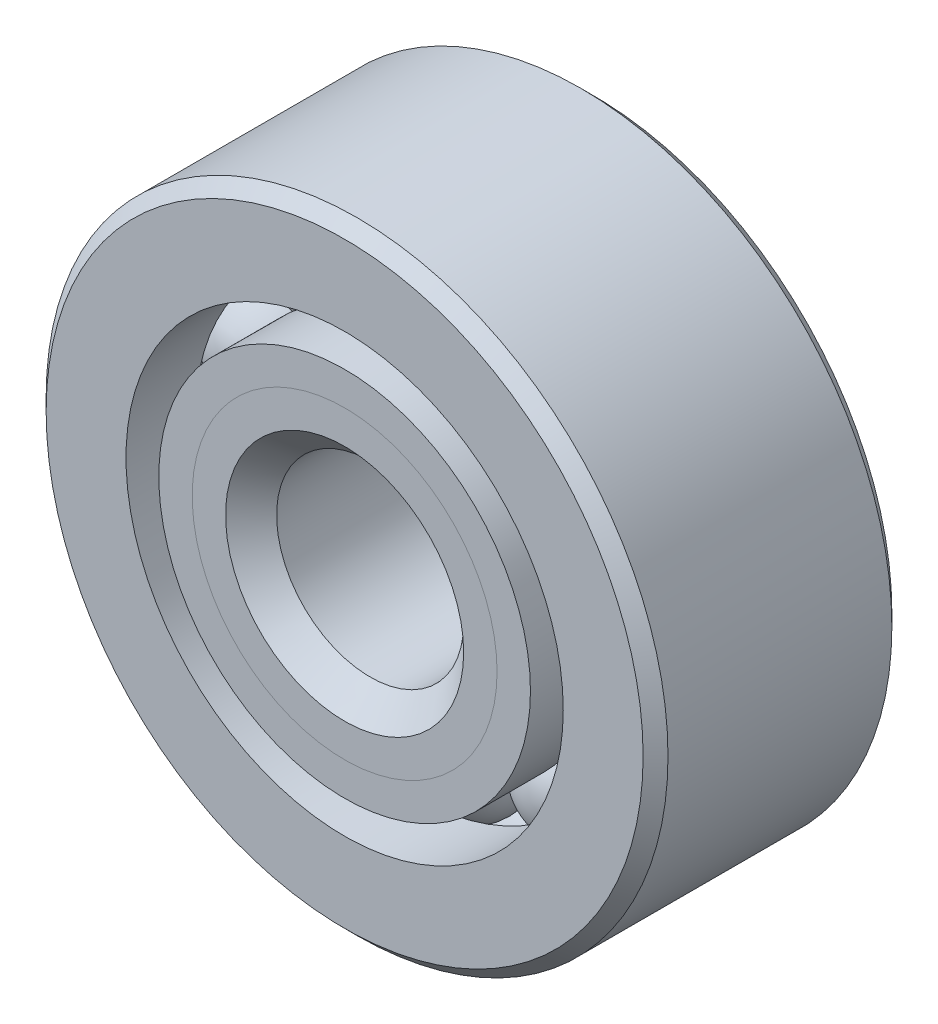
ISO-10303-21;
HEADER;
FILE_DESCRIPTION(('STEP AP214'),'2;1');
FILE_NAME('part.step','',(''),(''),'','','');
FILE_SCHEMA(('AUTOMOTIVE_DESIGN { 1 0 10303 214 1 1 1 1 }'));
ENDSEC;
DATA;
#1=APPLICATION_CONTEXT('core data for automotive mechanical design processes');
#2=APPLICATION_PROTOCOL_DEFINITION('international standard','automotive_design',2000,#1);
#3=PRODUCT_CONTEXT('',#1,'mechanical');
#4=PRODUCT('Part','Part','',(#3));
#5=PRODUCT_RELATED_PRODUCT_CATEGORY('part','',(#4));
#6=PRODUCT_DEFINITION_FORMATION('','',#4);
#7=PRODUCT_DEFINITION_CONTEXT('part definition',#1,'design');
#8=PRODUCT_DEFINITION('design','',#6,#7);
#9=PRODUCT_DEFINITION_SHAPE('','',#8);
#10=(LENGTH_UNIT() NAMED_UNIT(*) SI_UNIT(.MILLI.,.METRE.));
#11=(NAMED_UNIT(*) PLANE_ANGLE_UNIT() SI_UNIT($,.RADIAN.));
#12=(NAMED_UNIT(*) SI_UNIT($,.STERADIAN.) SOLID_ANGLE_UNIT());
#13=UNCERTAINTY_MEASURE_WITH_UNIT(LENGTH_MEASURE(1.E-05),#10,'distance_accuracy_value','');
#14=(GEOMETRIC_REPRESENTATION_CONTEXT(3) GLOBAL_UNCERTAINTY_ASSIGNED_CONTEXT((#13)) GLOBAL_UNIT_ASSIGNED_CONTEXT((#10,
#11,#12)) REPRESENTATION_CONTEXT('',''));
#15=CARTESIAN_POINT('',(0.,0.,0.));
#16=DIRECTION('',(0.,0.,1.));
#17=DIRECTION('',(1.,0.,0.));
#18=AXIS2_PLACEMENT_3D('',#15,#16,#17);
#19=CARTESIAN_POINT('',(-0.758617688555613,1.04414767107761,0.));
#20=DIRECTION('',(0.,0.,1.));
#21=DIRECTION('',(-0.587785252292462,0.809016994374955,0.));
#22=AXIS2_PLACEMENT_3D('',#19,#20,#21);
#23=SPHERICAL_SURFACE('',#22,0.367978312414091);
#24=CARTESIAN_POINT('',(-0.758617688555613,1.04414767107761,0.367978312414091));
#25=VERTEX_POINT('',#24);
#26=VERTEX_LOOP('',#25);
#27=FACE_BOUND('',#26,.T.);
#28=ADVANCED_FACE('F46',(#27),#23,.T.);
#29=CLOSED_SHELL('',(#28));
#30=MANIFOLD_SOLID_BREP('B2',#29);
#31=CARTESIAN_POINT('',(-1.22746920454988,0.39882892107761,0.));
#32=DIRECTION('',(0.,0.,1.));
#33=DIRECTION('',(-0.95105651629515,0.309016994374958,0.));
#34=AXIS2_PLACEMENT_3D('',#31,#32,#33);
#35=SPHERICAL_SURFACE('',#34,0.367978312414091);
#36=CARTESIAN_POINT('',(-1.22746920454988,0.39882892107761,0.367978312414091));
#37=VERTEX_POINT('',#36);
#38=VERTEX_LOOP('',#37);
#39=FACE_BOUND('',#38,.T.);
#40=ADVANCED_FACE('F81',(#39),#35,.T.);
#41=CLOSED_SHELL('',(#40));
#42=MANIFOLD_SOLID_BREP('B6',#41);
#43=CARTESIAN_POINT('',(-1.22746920454989,-0.398828921077584,0.));
#44=DIRECTION('',(0.,0.,1.));
#45=DIRECTION('',(-0.951056516295157,-0.309016994374938,0.));
#46=AXIS2_PLACEMENT_3D('',#43,#44,#45);
#47=SPHERICAL_SURFACE('',#46,0.367978312414091);
#48=CARTESIAN_POINT('',(-1.22746920454989,-0.398828921077584,0.367978312414091));
#49=VERTEX_POINT('',#48);
#50=VERTEX_LOOP('',#49);
#51=FACE_BOUND('',#50,.T.);
#52=ADVANCED_FACE('F118',(#51),#47,.T.);
#53=CLOSED_SHELL('',(#52));
#54=MANIFOLD_SOLID_BREP('B42',#53);
#55=CARTESIAN_POINT('',(-0.758617688555636,-1.04414767107759,0.));
#56=DIRECTION('',(0.,0.,1.));
#57=DIRECTION('',(-0.58778525229248,-0.809016994374942,0.));
#58=AXIS2_PLACEMENT_3D('',#55,#56,#57);
#59=SPHERICAL_SURFACE('',#58,0.367978312414091);
#60=CARTESIAN_POINT('',(-0.758617688555636,-1.04414767107759,0.367978312414091));
#61=VERTEX_POINT('',#60);
#62=VERTEX_LOOP('',#61);
#63=FACE_BOUND('',#62,.T.);
#64=ADVANCED_FACE('F155',(#63),#59,.T.);
#65=CLOSED_SHELL('',(#64));
#66=MANIFOLD_SOLID_BREP('B77',#65);
#67=CARTESIAN_POINT('',(0.,-1.2906375,0.));
#68=DIRECTION('',(0.,0.,1.));
#69=DIRECTION('',(0.,-1.,0.));
#70=AXIS2_PLACEMENT_3D('',#67,#68,#69);
#71=SPHERICAL_SURFACE('',#70,0.367978312414091);
#72=CARTESIAN_POINT('',(0.,-1.2906375,0.367978312414091));
#73=VERTEX_POINT('',#72);
#74=VERTEX_LOOP('',#73);
#75=FACE_BOUND('',#74,.T.);
#76=ADVANCED_FACE('F192',(#75),#71,.T.);
#77=CLOSED_SHELL('',(#76));
#78=MANIFOLD_SOLID_BREP('B114',#77);
#79=CARTESIAN_POINT('',(0.758617688555621,-1.0441476710776,0.));
#80=DIRECTION('',(0.,0.,1.));
#81=DIRECTION('',(0.587785252292469,-0.809016994374951,0.));
#82=AXIS2_PLACEMENT_3D('',#79,#80,#81);
#83=SPHERICAL_SURFACE('',#82,0.367978312414091);
#84=CARTESIAN_POINT('',(0.758617688555621,-1.0441476710776,0.367978312414091));
#85=VERTEX_POINT('',#84);
#86=VERTEX_LOOP('',#85);
#87=FACE_BOUND('',#86,.T.);
#88=ADVANCED_FACE('F227',(#87),#83,.T.);
#89=CLOSED_SHELL('',(#88));
#90=MANIFOLD_SOLID_BREP('B151',#89);
#91=CARTESIAN_POINT('',(1.22746920454988,-0.398828921077602,0.));
#92=DIRECTION('',(0.,0.,1.));
#93=DIRECTION('',(0.951056516295152,-0.309016994374952,0.));
#94=AXIS2_PLACEMENT_3D('',#91,#92,#93);
#95=SPHERICAL_SURFACE('',#94,0.367978312414091);
#96=CARTESIAN_POINT('',(1.22746920454988,-0.398828921077602,0.367978312414091));
#97=VERTEX_POINT('',#96);
#98=VERTEX_LOOP('',#97);
#99=FACE_BOUND('',#98,.T.);
#100=ADVANCED_FACE('F262',(#99),#95,.T.);
#101=CLOSED_SHELL('',(#100));
#102=MANIFOLD_SOLID_BREP('B188',#101);
#103=CARTESIAN_POINT('',(1.22746920454989,0.398828921077593,0.));
#104=DIRECTION('',(0.,0.,1.));
#105=DIRECTION('',(0.951056516295155,0.309016994374945,0.));
#106=AXIS2_PLACEMENT_3D('',#103,#104,#105);
#107=SPHERICAL_SURFACE('',#106,0.367978312414091);
#108=CARTESIAN_POINT('',(1.22746920454989,0.398828921077593,0.367978312414091));
#109=VERTEX_POINT('',#108);
#110=VERTEX_LOOP('',#109);
#111=FACE_BOUND('',#110,.T.);
#112=ADVANCED_FACE('F297',(#111),#107,.T.);
#113=CLOSED_SHELL('',(#112));
#114=MANIFOLD_SOLID_BREP('B223',#113);
#115=CARTESIAN_POINT('',(0.758617688555628,1.0441476710776,0.));
#116=DIRECTION('',(0.,0.,1.));
#117=DIRECTION('',(0.587785252292474,0.809016994374947,0.));
#118=AXIS2_PLACEMENT_3D('',#115,#116,#117);
#119=SPHERICAL_SURFACE('',#118,0.367978312414091);
#120=CARTESIAN_POINT('',(0.758617688555628,1.0441476710776,0.367978312414091));
#121=VERTEX_POINT('',#120);
#122=VERTEX_LOOP('',#121);
#123=FACE_BOUND('',#122,.T.);
#124=ADVANCED_FACE('F332',(#123),#119,.T.);
#125=CLOSED_SHELL('',(#124));
#126=MANIFOLD_SOLID_BREP('B258',#125);
#127=CARTESIAN_POINT('',(0.,1.2906375,0.));
#128=DIRECTION('',(0.,0.,1.));
#129=DIRECTION('',(0.,1.,0.));
#130=AXIS2_PLACEMENT_3D('',#127,#128,#129);
#131=SPHERICAL_SURFACE('',#130,0.367978312414091);
#132=CARTESIAN_POINT('',(0.,1.2906375,0.367978312414091));
#133=VERTEX_POINT('',#132);
#134=VERTEX_LOOP('',#133);
#135=FACE_BOUND('',#134,.T.);
#136=ADVANCED_FACE('F369',(#135),#131,.T.);
#137=CLOSED_SHELL('',(#136));
#138=MANIFOLD_SOLID_BREP('B293',#137);
#139=CARTESIAN_POINT('',(0.,0.972873382061313,0.79375));
#140=DIRECTION('',(0.,0.,-1.));
#141=DIRECTION('',(-1.,0.,0.));
#142=AXIS2_PLACEMENT_3D('',#139,#140,#141);
#143=PLANE('',#142);
#144=CARTESIAN_POINT('',(0.,0.,0.79375));
#145=DIRECTION('',(0.,0.,1.));
#146=DIRECTION('',(1.,0.,0.));
#147=AXIS2_PLACEMENT_3D('',#144,#145,#146);
#148=CIRCLE('',#147,0.759779593792954);
#149=CARTESIAN_POINT('',(0.759779593792954,0.,0.79375));
#150=VERTEX_POINT('',#149);
#151=EDGE_CURVE('E435',#150,#150,#148,.T.);
#152=ORIENTED_EDGE('',*,*,#151,.F.);
#153=EDGE_LOOP('',(#152));
#154=FACE_BOUND('',#153,.T.);
#155=CARTESIAN_POINT('',(0.,0.,0.79375));
#156=DIRECTION('',(0.,0.,1.));
#157=DIRECTION('',(1.,0.,0.));
#158=AXIS2_PLACEMENT_3D('',#155,#156,#157);
#159=CIRCLE('',#158,0.972873382061313);
#160=CARTESIAN_POINT('',(0.972873382061313,0.,0.79375));
#161=VERTEX_POINT('',#160);
#162=EDGE_CURVE('E368',#161,#161,#159,.T.);
#163=ORIENTED_EDGE('',*,*,#162,.T.);
#164=EDGE_LOOP('',(#163));
#165=FACE_BOUND('',#164,.T.);
#166=ADVANCED_FACE('F390',(#154,#165),#143,.F.);
#167=CARTESIAN_POINT('',(0.,0.,0.580656211731643));
#168=DIRECTION('',(0.,0.,1.));
#169=DIRECTION('',(1.,0.,0.));
#170=AXIS2_PLACEMENT_3D('',#167,#168,#169);
#171=CONICAL_SURFACE('',#170,0.759779593792954,0.78539816339745);
#172=ORIENTED_EDGE('',*,*,#162,.F.);
#173=EDGE_LOOP('',(#172));
#174=FACE_BOUND('',#173,.T.);
#175=CARTESIAN_POINT('',(0.,0.,0.580656211731643));
#176=DIRECTION('',(0.,0.,1.));
#177=DIRECTION('',(1.,0.,0.));
#178=AXIS2_PLACEMENT_3D('',#175,#176,#177);
#179=CIRCLE('',#178,0.759779593792954);
#180=CARTESIAN_POINT('',(0.759779593792954,0.,0.580656211731643));
#181=VERTEX_POINT('',#180);
#182=EDGE_CURVE('E397',#181,#181,#179,.T.);
#183=ORIENTED_EDGE('',*,*,#182,.T.);
#184=EDGE_LOOP('',(#183));
#185=FACE_BOUND('',#184,.T.);
#186=ADVANCED_FACE('F444',(#174,#185),#171,.T.);
#187=CARTESIAN_POINT('',(0.,0.,0.79375));
#188=DIRECTION('',(0.,0.,1.));
#189=DIRECTION('',(1.,0.,0.));
#190=AXIS2_PLACEMENT_3D('',#187,#188,#189);
#191=CYLINDRICAL_SURFACE('',#190,0.759779593792954);
#192=ORIENTED_EDGE('',*,*,#182,.F.);
#193=EDGE_LOOP('',(#192));
#194=FACE_BOUND('',#193,.T.);
#195=CARTESIAN_POINT('',(0.,0.,0.));
#196=DIRECTION('',(0.,0.,1.));
#197=DIRECTION('',(1.,0.,0.));
#198=AXIS2_PLACEMENT_3D('',#195,#196,#197);
#199=CIRCLE('',#198,0.759779593792954);
#200=CARTESIAN_POINT('',(0.759779593792954,0.,0.));
#201=VERTEX_POINT('',#200);
#202=EDGE_CURVE('E403',#201,#201,#199,.T.);
#203=ORIENTED_EDGE('',*,*,#202,.T.);
#204=EDGE_LOOP('',(#203));
#205=FACE_BOUND('',#204,.T.);
#206=ADVANCED_FACE('F448',(#194,#205),#191,.T.);
#207=CARTESIAN_POINT('',(0.,0.759779593792954,0.));
#208=DIRECTION('',(0.,0.,-1.));
#209=DIRECTION('',(-1.,0.,0.));
#210=AXIS2_PLACEMENT_3D('',#207,#208,#209);
#211=PLANE('',#210);
#212=ORIENTED_EDGE('',*,*,#202,.F.);
#213=EDGE_LOOP('',(#212));
#214=FACE_BOUND('',#213,.T.);
#215=CARTESIAN_POINT('',(0.,0.,0.));
#216=DIRECTION('',(0.,0.,1.));
#217=DIRECTION('',(1.,0.,0.));
#218=AXIS2_PLACEMENT_3D('',#215,#216,#217);
#219=CIRCLE('',#218,0.922659187585909);
#220=CARTESIAN_POINT('',(0.922659187585909,0.,0.));
#221=VERTEX_POINT('',#220);
#222=EDGE_CURVE('E409',#221,#221,#219,.T.);
#223=ORIENTED_EDGE('',*,*,#222,.T.);
#224=EDGE_LOOP('',(#223));
#225=FACE_BOUND('',#224,.T.);
#226=ADVANCED_FACE('F453',(#214,#225),#211,.F.);
#227=CARTESIAN_POINT('',(0.,0.,0.));
#228=DIRECTION('',(0.,0.,1.));
#229=DIRECTION('',(1.,0.,0.));
#230=AXIS2_PLACEMENT_3D('',#227,#228,#229);
#231=TOROIDAL_SURFACE('',#230,1.2906375,0.367978312414091);
#232=ORIENTED_EDGE('',*,*,#222,.F.);
#233=EDGE_LOOP('',(#232));
#234=FACE_BOUND('',#233,.T.);
#235=CARTESIAN_POINT('',(0.,0.,-0.352777777777778));
#236=DIRECTION('',(0.,0.,1.));
#237=DIRECTION('',(1.,0.,0.));
#238=AXIS2_PLACEMENT_3D('',#235,#236,#237);
#239=CIRCLE('',#238,1.18596717032967);
#240=CARTESIAN_POINT('',(1.18596717032967,0.,-0.352777777777778));
#241=VERTEX_POINT('',#240);
#242=EDGE_CURVE('E415',#241,#241,#239,.T.);
#243=ORIENTED_EDGE('',*,*,#242,.T.);
#244=EDGE_LOOP('',(#243));
#245=FACE_BOUND('',#244,.T.);
#246=ADVANCED_FACE('F459',(#234,#245),#231,.F.);
#247=CARTESIAN_POINT('',(0.,0.,0.79375));
#248=DIRECTION('',(0.,0.,1.));
#249=DIRECTION('',(1.,0.,0.));
#250=AXIS2_PLACEMENT_3D('',#247,#248,#249);
#251=CYLINDRICAL_SURFACE('',#250,1.18596717032967);
#252=ORIENTED_EDGE('',*,*,#242,.F.);
#253=EDGE_LOOP('',(#252));
#254=FACE_BOUND('',#253,.T.);
#255=CARTESIAN_POINT('',(0.,0.,-0.793750000000001));
#256=DIRECTION('',(0.,0.,1.));
#257=DIRECTION('',(1.,0.,0.));
#258=AXIS2_PLACEMENT_3D('',#255,#256,#257);
#259=CIRCLE('',#258,1.18596717032967);
#260=CARTESIAN_POINT('',(1.18596717032967,0.,-0.793750000000001));
#261=VERTEX_POINT('',#260);
#262=EDGE_CURVE('E419',#261,#261,#259,.T.);
#263=ORIENTED_EDGE('',*,*,#262,.T.);
#264=EDGE_LOOP('',(#263));
#265=FACE_BOUND('',#264,.T.);
#266=ADVANCED_FACE('F463',(#254,#265),#251,.T.);
#267=CARTESIAN_POINT('',(0.,0.676274999999999,-0.793750000000001));
#268=DIRECTION('',(0.,0.,1.));
#269=DIRECTION('',(1.,0.,0.));
#270=AXIS2_PLACEMENT_3D('',#267,#268,#269);
#271=PLANE('',#270);
#272=ORIENTED_EDGE('',*,*,#262,.F.);
#273=EDGE_LOOP('',(#272));
#274=FACE_BOUND('',#273,.T.);
#275=CARTESIAN_POINT('',(0.,0.,-0.793750000000001));
#276=DIRECTION('',(0.,0.,1.));
#277=DIRECTION('',(1.,0.,0.));
#278=AXIS2_PLACEMENT_3D('',#275,#276,#277);
#279=CIRCLE('',#278,0.676274999999999);
#280=CARTESIAN_POINT('',(0.676274999999999,0.,-0.793750000000001));
#281=VERTEX_POINT('',#280);
#282=EDGE_CURVE('E423',#281,#281,#279,.T.);
#283=ORIENTED_EDGE('',*,*,#282,.T.);
#284=EDGE_LOOP('',(#283));
#285=FACE_BOUND('',#284,.T.);
#286=ADVANCED_FACE('F467',(#274,#285),#271,.F.);
#287=CARTESIAN_POINT('',(0.,0.,-0.714375000000001));
#288=DIRECTION('',(0.,0.,-1.));
#289=DIRECTION('',(-1.,0.,0.));
#290=AXIS2_PLACEMENT_3D('',#287,#288,#289);
#291=CONICAL_SURFACE('',#290,0.5969,0.785398163397446);
#292=ORIENTED_EDGE('',*,*,#282,.F.);
#293=EDGE_LOOP('',(#292));
#294=FACE_BOUND('',#293,.T.);
#295=CARTESIAN_POINT('',(0.,0.,-0.714375000000001));
#296=DIRECTION('',(0.,0.,1.));
#297=DIRECTION('',(1.,0.,0.));
#298=AXIS2_PLACEMENT_3D('',#295,#296,#297);
#299=CIRCLE('',#298,0.5969);
#300=CARTESIAN_POINT('',(0.5969,0.,-0.714375000000001));
#301=VERTEX_POINT('',#300);
#302=EDGE_CURVE('E427',#301,#301,#299,.T.);
#303=ORIENTED_EDGE('',*,*,#302,.T.);
#304=EDGE_LOOP('',(#303));
#305=FACE_BOUND('',#304,.T.);
#306=ADVANCED_FACE('F471',(#294,#305),#291,.F.);
#307=CARTESIAN_POINT('',(0.,0.,0.79375));
#308=DIRECTION('',(0.,0.,1.));
#309=DIRECTION('',(1.,0.,0.));
#310=AXIS2_PLACEMENT_3D('',#307,#308,#309);
#311=CYLINDRICAL_SURFACE('',#310,0.5969);
#312=ORIENTED_EDGE('',*,*,#302,.F.);
#313=EDGE_LOOP('',(#312));
#314=FACE_BOUND('',#313,.T.);
#315=CARTESIAN_POINT('',(0.,0.,0.630870406207046));
#316=DIRECTION('',(0.,0.,1.));
#317=DIRECTION('',(1.,0.,0.));
#318=AXIS2_PLACEMENT_3D('',#315,#316,#317);
#319=CIRCLE('',#318,0.5969);
#320=CARTESIAN_POINT('',(0.5969,0.,0.630870406207046));
#321=VERTEX_POINT('',#320);
#322=EDGE_CURVE('E431',#321,#321,#319,.T.);
#323=ORIENTED_EDGE('',*,*,#322,.T.);
#324=EDGE_LOOP('',(#323));
#325=FACE_BOUND('',#324,.T.);
#326=ADVANCED_FACE('F475',(#314,#325),#311,.F.);
#327=CARTESIAN_POINT('',(0.,0.,0.79375));
#328=DIRECTION('',(0.,0.,1.));
#329=DIRECTION('',(1.,0.,0.));
#330=AXIS2_PLACEMENT_3D('',#327,#328,#329);
#331=CONICAL_SURFACE('',#330,0.759779593792954,0.785398163397448);
#332=ORIENTED_EDGE('',*,*,#322,.F.);
#333=EDGE_LOOP('',(#332));
#334=FACE_BOUND('',#333,.T.);
#335=ORIENTED_EDGE('',*,*,#151,.T.);
#336=EDGE_LOOP('',(#335));
#337=FACE_BOUND('',#336,.T.);
#338=ADVANCED_FACE('F441',(#334,#337),#331,.F.);
#339=CLOSED_SHELL('',(#166,#186,#206,#226,#246,#266,#286,#306,#326,#338));
#340=MANIFOLD_SOLID_BREP('B328',#339);
#341=CARTESIAN_POINT('',(0.,1.18596717032967,0.79375));
#342=DIRECTION('',(0.,0.,-1.));
#343=DIRECTION('',(-1.,0.,0.));
#344=AXIS2_PLACEMENT_3D('',#341,#342,#343);
#345=PLANE('',#344);
#346=CARTESIAN_POINT('',(0.,0.,0.79375));
#347=DIRECTION('',(0.,0.,1.));
#348=DIRECTION('',(1.,0.,0.));
#349=AXIS2_PLACEMENT_3D('',#346,#347,#348);
#350=CIRCLE('',#349,0.972873382061313);
#351=CARTESIAN_POINT('',(0.972873382061313,0.,0.79375));
#352=VERTEX_POINT('',#351);
#353=EDGE_CURVE('E389',#352,#352,#350,.T.);
#354=ORIENTED_EDGE('',*,*,#353,.F.);
#355=EDGE_LOOP('',(#354));
#356=FACE_BOUND('',#355,.T.);
#357=CARTESIAN_POINT('',(0.,0.,0.79375));
#358=DIRECTION('',(0.,0.,1.));
#359=DIRECTION('',(1.,0.,0.));
#360=AXIS2_PLACEMENT_3D('',#357,#358,#359);
#361=CIRCLE('',#360,1.18596717032967);
#362=CARTESIAN_POINT('',(1.18596717032967,0.,0.79375));
#363=VERTEX_POINT('',#362);
#364=EDGE_CURVE('E598',#363,#363,#361,.T.);
#365=ORIENTED_EDGE('',*,*,#364,.T.);
#366=EDGE_LOOP('',(#365));
#367=FACE_BOUND('',#366,.T.);
#368=ADVANCED_FACE('F569',(#356,#367),#345,.F.);
#369=CARTESIAN_POINT('',(0.,0.,0.79375));
#370=DIRECTION('',(0.,0.,1.));
#371=DIRECTION('',(1.,0.,0.));
#372=AXIS2_PLACEMENT_3D('',#369,#370,#371);
#373=CONICAL_SURFACE('',#372,0.972873382061313,0.78539816339745);
#374=CARTESIAN_POINT('',(0.,0.,0.580656211731643));
#375=DIRECTION('',(0.,0.,1.));
#376=DIRECTION('',(1.,0.,0.));
#377=AXIS2_PLACEMENT_3D('',#374,#375,#376);
#378=CIRCLE('',#377,0.759779593792954);
#379=CARTESIAN_POINT('',(0.759779593792954,0.,0.580656211731643));
#380=VERTEX_POINT('',#379);
#381=EDGE_CURVE('E576',#380,#380,#378,.T.);
#382=ORIENTED_EDGE('',*,*,#381,.F.);
#383=EDGE_LOOP('',(#382));
#384=FACE_BOUND('',#383,.T.);
#385=ORIENTED_EDGE('',*,*,#353,.T.);
#386=EDGE_LOOP('',(#385));
#387=FACE_BOUND('',#386,.T.);
#388=ADVANCED_FACE('F625',(#384,#387),#373,.F.);
#389=CARTESIAN_POINT('',(0.,0.,0.79375));
#390=DIRECTION('',(0.,0.,1.));
#391=DIRECTION('',(1.,0.,0.));
#392=AXIS2_PLACEMENT_3D('',#389,#390,#391);
#393=CYLINDRICAL_SURFACE('',#392,0.759779593792954);
#394=CARTESIAN_POINT('',(0.,0.,0.));
#395=DIRECTION('',(0.,0.,1.));
#396=DIRECTION('',(1.,0.,0.));
#397=AXIS2_PLACEMENT_3D('',#394,#395,#396);
#398=CIRCLE('',#397,0.759779593792954);
#399=CARTESIAN_POINT('',(0.759779593792954,0.,0.));
#400=VERTEX_POINT('',#399);
#401=EDGE_CURVE('E582',#400,#400,#398,.T.);
#402=ORIENTED_EDGE('',*,*,#401,.F.);
#403=EDGE_LOOP('',(#402));
#404=FACE_BOUND('',#403,.T.);
#405=ORIENTED_EDGE('',*,*,#381,.T.);
#406=EDGE_LOOP('',(#405));
#407=FACE_BOUND('',#406,.T.);
#408=ADVANCED_FACE('F620',(#404,#407),#393,.F.);
#409=CARTESIAN_POINT('',(0.,0.759779593792954,0.));
#410=DIRECTION('',(0.,0.,1.));
#411=DIRECTION('',(1.,0.,0.));
#412=AXIS2_PLACEMENT_3D('',#409,#410,#411);
#413=PLANE('',#412);
#414=CARTESIAN_POINT('',(0.,0.,0.));
#415=DIRECTION('',(0.,0.,1.));
#416=DIRECTION('',(1.,0.,0.));
#417=AXIS2_PLACEMENT_3D('',#414,#415,#416);
#418=CIRCLE('',#417,0.922659187585909);
#419=CARTESIAN_POINT('',(0.922659187585909,0.,0.));
#420=VERTEX_POINT('',#419);
#421=EDGE_CURVE('E588',#420,#420,#418,.T.);
#422=ORIENTED_EDGE('',*,*,#421,.F.);
#423=EDGE_LOOP('',(#422));
#424=FACE_BOUND('',#423,.T.);
#425=ORIENTED_EDGE('',*,*,#401,.T.);
#426=EDGE_LOOP('',(#425));
#427=FACE_BOUND('',#426,.T.);
#428=ADVANCED_FACE('F614',(#424,#427),#413,.F.);
#429=CARTESIAN_POINT('',(0.,0.,0.));
#430=DIRECTION('',(0.,0.,1.));
#431=DIRECTION('',(1.,0.,0.));
#432=AXIS2_PLACEMENT_3D('',#429,#430,#431);
#433=TOROIDAL_SURFACE('',#432,1.2906375,0.367978312414091);
#434=CARTESIAN_POINT('',(0.,0.,0.352777777777777));
#435=DIRECTION('',(0.,0.,1.));
#436=DIRECTION('',(1.,0.,0.));
#437=AXIS2_PLACEMENT_3D('',#434,#435,#436);
#438=CIRCLE('',#437,1.18596717032967);
#439=CARTESIAN_POINT('',(1.18596717032967,0.,0.352777777777777));
#440=VERTEX_POINT('',#439);
#441=EDGE_CURVE('E594',#440,#440,#438,.T.);
#442=ORIENTED_EDGE('',*,*,#441,.F.);
#443=EDGE_LOOP('',(#442));
#444=FACE_BOUND('',#443,.T.);
#445=ORIENTED_EDGE('',*,*,#421,.T.);
#446=EDGE_LOOP('',(#445));
#447=FACE_BOUND('',#446,.T.);
#448=ADVANCED_FACE('F608',(#444,#447),#433,.F.);
#449=CARTESIAN_POINT('',(0.,0.,0.79375));
#450=DIRECTION('',(0.,0.,1.));
#451=DIRECTION('',(1.,0.,0.));
#452=AXIS2_PLACEMENT_3D('',#449,#450,#451);
#453=CYLINDRICAL_SURFACE('',#452,1.18596717032967);
#454=ORIENTED_EDGE('',*,*,#364,.F.);
#455=EDGE_LOOP('',(#454));
#456=FACE_BOUND('',#455,.T.);
#457=ORIENTED_EDGE('',*,*,#441,.T.);
#458=EDGE_LOOP('',(#457));
#459=FACE_BOUND('',#458,.T.);
#460=ADVANCED_FACE('F605',(#456,#459),#453,.T.);
#461=CLOSED_SHELL('',(#368,#388,#408,#428,#448,#460));
#462=MANIFOLD_SOLID_BREP('B363',#461);
#463=CARTESIAN_POINT('',(0.,0.,0.714375));
#464=DIRECTION('',(0.,0.,-1.));
#465=DIRECTION('',(-1.,0.,0.));
#466=AXIS2_PLACEMENT_3D('',#463,#464,#465);
#467=CONICAL_SURFACE('',#466,1.984375,0.78539816339744);
#468=CARTESIAN_POINT('',(0.,0.,0.79375));
#469=DIRECTION('',(0.,0.,1.));
#470=DIRECTION('',(1.,0.,0.));
#471=AXIS2_PLACEMENT_3D('',#468,#469,#470);
#472=CIRCLE('',#471,1.905);
#473=CARTESIAN_POINT('',(1.905,0.,0.79375));
#474=VERTEX_POINT('',#473);
#475=EDGE_CURVE('E710',#474,#474,#472,.T.);
#476=ORIENTED_EDGE('',*,*,#475,.F.);
#477=EDGE_LOOP('',(#476));
#478=FACE_BOUND('',#477,.T.);
#479=CARTESIAN_POINT('',(0.,0.,0.714375));
#480=DIRECTION('',(0.,0.,1.));
#481=DIRECTION('',(1.,0.,0.));
#482=AXIS2_PLACEMENT_3D('',#479,#480,#481);
#483=CIRCLE('',#482,1.984375);
#484=CARTESIAN_POINT('',(1.984375,0.,0.714375));
#485=VERTEX_POINT('',#484);
#486=EDGE_CURVE('E568',#485,#485,#483,.T.);
#487=ORIENTED_EDGE('',*,*,#486,.T.);
#488=EDGE_LOOP('',(#487));
#489=FACE_BOUND('',#488,.T.);
#490=ADVANCED_FACE('F673',(#478,#489),#467,.T.);
#491=CARTESIAN_POINT('',(0.,0.,0.79375));
#492=DIRECTION('',(0.,0.,1.));
#493=DIRECTION('',(1.,0.,0.));
#494=AXIS2_PLACEMENT_3D('',#491,#492,#493);
#495=CYLINDRICAL_SURFACE('',#494,1.984375);
#496=ORIENTED_EDGE('',*,*,#486,.F.);
#497=EDGE_LOOP('',(#496));
#498=FACE_BOUND('',#497,.T.);
#499=CARTESIAN_POINT('',(0.,0.,-0.714375000000001));
#500=DIRECTION('',(0.,0.,1.));
#501=DIRECTION('',(1.,0.,0.));
#502=AXIS2_PLACEMENT_3D('',#499,#500,#501);
#503=CIRCLE('',#502,1.984375);
#504=CARTESIAN_POINT('',(1.984375,0.,-0.714375000000001));
#505=VERTEX_POINT('',#504);
#506=EDGE_CURVE('E680',#505,#505,#503,.T.);
#507=ORIENTED_EDGE('',*,*,#506,.T.);
#508=EDGE_LOOP('',(#507));
#509=FACE_BOUND('',#508,.T.);
#510=ADVANCED_FACE('F719',(#498,#509),#495,.T.);
#511=CARTESIAN_POINT('',(0.,0.,-0.793750000000001));
#512=DIRECTION('',(0.,0.,1.));
#513=DIRECTION('',(1.,0.,0.));
#514=AXIS2_PLACEMENT_3D('',#511,#512,#513);
#515=CONICAL_SURFACE('',#514,1.905,0.78539816339744);
#516=ORIENTED_EDGE('',*,*,#506,.F.);
#517=EDGE_LOOP('',(#516));
#518=FACE_BOUND('',#517,.T.);
#519=CARTESIAN_POINT('',(0.,0.,-0.793750000000001));
#520=DIRECTION('',(0.,0.,1.));
#521=DIRECTION('',(1.,0.,0.));
#522=AXIS2_PLACEMENT_3D('',#519,#520,#521);
#523=CIRCLE('',#522,1.905);
#524=CARTESIAN_POINT('',(1.905,0.,-0.793750000000001));
#525=VERTEX_POINT('',#524);
#526=EDGE_CURVE('E686',#525,#525,#523,.T.);
#527=ORIENTED_EDGE('',*,*,#526,.T.);
#528=EDGE_LOOP('',(#527));
#529=FACE_BOUND('',#528,.T.);
#530=ADVANCED_FACE('F723',(#518,#529),#515,.T.);
#531=CARTESIAN_POINT('',(0.,1.905,-0.793750000000001));
#532=DIRECTION('',(0.,0.,1.));
#533=DIRECTION('',(1.,0.,0.));
#534=AXIS2_PLACEMENT_3D('',#531,#532,#533);
#535=PLANE('',#534);
#536=ORIENTED_EDGE('',*,*,#526,.F.);
#537=EDGE_LOOP('',(#536));
#538=FACE_BOUND('',#537,.T.);
#539=CARTESIAN_POINT('',(0.,0.,-0.793750000000002));
#540=DIRECTION('',(0.,0.,1.));
#541=DIRECTION('',(1.,0.,0.));
#542=AXIS2_PLACEMENT_3D('',#539,#540,#541);
#543=CIRCLE('',#542,1.39530782967033);
#544=CARTESIAN_POINT('',(1.39530782967033,0.,-0.793750000000002));
#545=VERTEX_POINT('',#544);
#546=EDGE_CURVE('E692',#545,#545,#543,.T.);
#547=ORIENTED_EDGE('',*,*,#546,.T.);
#548=EDGE_LOOP('',(#547));
#549=FACE_BOUND('',#548,.T.);
#550=ADVANCED_FACE('F728',(#538,#549),#535,.F.);
#551=CARTESIAN_POINT('',(0.,0.,0.79375));
#552=DIRECTION('',(0.,0.,1.));
#553=DIRECTION('',(1.,0.,0.));
#554=AXIS2_PLACEMENT_3D('',#551,#552,#553);
#555=CYLINDRICAL_SURFACE('',#554,1.39530782967033);
#556=ORIENTED_EDGE('',*,*,#546,.F.);
#557=EDGE_LOOP('',(#556));
#558=FACE_BOUND('',#557,.T.);
#559=CARTESIAN_POINT('',(0.,0.,-0.352777777777778));
#560=DIRECTION('',(0.,0.,1.));
#561=DIRECTION('',(1.,0.,0.));
#562=AXIS2_PLACEMENT_3D('',#559,#560,#561);
#563=CIRCLE('',#562,1.39530782967033);
#564=CARTESIAN_POINT('',(1.39530782967033,0.,-0.352777777777778));
#565=VERTEX_POINT('',#564);
#566=EDGE_CURVE('E698',#565,#565,#563,.T.);
#567=ORIENTED_EDGE('',*,*,#566,.T.);
#568=EDGE_LOOP('',(#567));
#569=FACE_BOUND('',#568,.T.);
#570=ADVANCED_FACE('F734',(#558,#569),#555,.F.);
#571=CARTESIAN_POINT('',(0.,0.,0.));
#572=DIRECTION('',(0.,0.,1.));
#573=DIRECTION('',(1.,0.,0.));
#574=AXIS2_PLACEMENT_3D('',#571,#572,#573);
#575=TOROIDAL_SURFACE('',#574,1.2906375,0.367978312414091);
#576=ORIENTED_EDGE('',*,*,#566,.F.);
#577=EDGE_LOOP('',(#576));
#578=FACE_BOUND('',#577,.T.);
#579=CARTESIAN_POINT('',(0.,0.,0.352777777777777));
#580=DIRECTION('',(0.,0.,1.));
#581=DIRECTION('',(1.,0.,0.));
#582=AXIS2_PLACEMENT_3D('',#579,#580,#581);
#583=CIRCLE('',#582,1.39530782967033);
#584=CARTESIAN_POINT('',(1.39530782967033,0.,0.352777777777777));
#585=VERTEX_POINT('',#584);
#586=EDGE_CURVE('E702',#585,#585,#583,.T.);
#587=ORIENTED_EDGE('',*,*,#586,.T.);
#588=EDGE_LOOP('',(#587));
#589=FACE_BOUND('',#588,.T.);
#590=ADVANCED_FACE('F738',(#578,#589),#575,.F.);
#591=CARTESIAN_POINT('',(0.,0.,0.79375));
#592=DIRECTION('',(0.,0.,1.));
#593=DIRECTION('',(1.,0.,0.));
#594=AXIS2_PLACEMENT_3D('',#591,#592,#593);
#595=CYLINDRICAL_SURFACE('',#594,1.39530782967033);
#596=ORIENTED_EDGE('',*,*,#586,.F.);
#597=EDGE_LOOP('',(#596));
#598=FACE_BOUND('',#597,.T.);
#599=CARTESIAN_POINT('',(0.,0.,0.79375));
#600=DIRECTION('',(0.,0.,1.));
#601=DIRECTION('',(1.,0.,0.));
#602=AXIS2_PLACEMENT_3D('',#599,#600,#601);
#603=CIRCLE('',#602,1.39530782967033);
#604=CARTESIAN_POINT('',(1.39530782967033,0.,0.79375));
#605=VERTEX_POINT('',#604);
#606=EDGE_CURVE('E706',#605,#605,#603,.T.);
#607=ORIENTED_EDGE('',*,*,#606,.T.);
#608=EDGE_LOOP('',(#607));
#609=FACE_BOUND('',#608,.T.);
#610=ADVANCED_FACE('F742',(#598,#609),#595,.F.);
#611=CARTESIAN_POINT('',(0.,1.905,0.79375));
#612=DIRECTION('',(0.,0.,-1.));
#613=DIRECTION('',(-1.,0.,0.));
#614=AXIS2_PLACEMENT_3D('',#611,#612,#613);
#615=PLANE('',#614);
#616=ORIENTED_EDGE('',*,*,#606,.F.);
#617=EDGE_LOOP('',(#616));
#618=FACE_BOUND('',#617,.T.);
#619=ORIENTED_EDGE('',*,*,#475,.T.);
#620=EDGE_LOOP('',(#619));
#621=FACE_BOUND('',#620,.T.);
#622=ADVANCED_FACE('F716',(#618,#621),#615,.F.);
#623=CLOSED_SHELL('',(#490,#510,#530,#550,#570,#590,#610,#622));
#624=MANIFOLD_SOLID_BREP('B384',#623);
#625=ADVANCED_BREP_SHAPE_REPRESENTATION('',(#18,#30,#42,#54,#66,#78,#90,#102,#114,#126,#138,
#340,#462,#624),#14);
#626=SHAPE_DEFINITION_REPRESENTATION(#9,#625);
ENDSEC;
END-ISO-10303-21;
